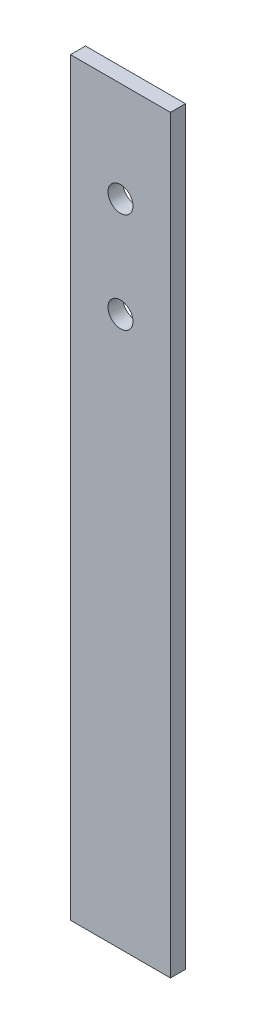
ISO-10303-21;
HEADER;
FILE_DESCRIPTION(('STEP AP214'),'2;1');
FILE_NAME('part.step','',(''),(''),'','','');
FILE_SCHEMA(('AUTOMOTIVE_DESIGN { 1 0 10303 214 1 1 1 1 }'));
ENDSEC;
DATA;
#1=APPLICATION_CONTEXT('core data for automotive mechanical design processes');
#2=APPLICATION_PROTOCOL_DEFINITION('international standard','automotive_design',2000,#1);
#3=PRODUCT_CONTEXT('',#1,'mechanical');
#4=PRODUCT('Part','Part','',(#3));
#5=PRODUCT_RELATED_PRODUCT_CATEGORY('part','',(#4));
#6=PRODUCT_DEFINITION_FORMATION('','',#4);
#7=PRODUCT_DEFINITION_CONTEXT('part definition',#1,'design');
#8=PRODUCT_DEFINITION('design','',#6,#7);
#9=PRODUCT_DEFINITION_SHAPE('','',#8);
#10=(LENGTH_UNIT() NAMED_UNIT(*) SI_UNIT(.MILLI.,.METRE.));
#11=(NAMED_UNIT(*) PLANE_ANGLE_UNIT() SI_UNIT($,.RADIAN.));
#12=(NAMED_UNIT(*) SI_UNIT($,.STERADIAN.) SOLID_ANGLE_UNIT());
#13=UNCERTAINTY_MEASURE_WITH_UNIT(LENGTH_MEASURE(1.E-05),#10,'distance_accuracy_value','');
#14=(GEOMETRIC_REPRESENTATION_CONTEXT(3) GLOBAL_UNCERTAINTY_ASSIGNED_CONTEXT((#13)) GLOBAL_UNIT_ASSIGNED_CONTEXT((#10,
#11,#12)) REPRESENTATION_CONTEXT('',''));
#15=CARTESIAN_POINT('',(0.,0.,0.));
#16=DIRECTION('',(0.,0.,1.));
#17=DIRECTION('',(1.,0.,0.));
#18=AXIS2_PLACEMENT_3D('',#15,#16,#17);
#19=CARTESIAN_POINT('',(92.469314483972,0.,3.));
#20=DIRECTION('',(1.,0.,0.));
#21=DIRECTION('',(0.,0.,-1.));
#22=AXIS2_PLACEMENT_3D('',#19,#20,#21);
#23=PLANE('',#22);
#24=DIRECTION('',(0.,-1.,0.));
#25=VECTOR('',#24,1.);
#26=CARTESIAN_POINT('',(92.469314483972,0.,0.));
#27=LINE('',#26,#25);
#28=CARTESIAN_POINT('',(92.469314483972,114.011656261006,0.));
#29=VERTEX_POINT('',#28);
#30=CARTESIAN_POINT('',(92.469314483972,-35.9883437389938,0.));
#31=VERTEX_POINT('',#30);
#32=EDGE_CURVE('E111',#29,#31,#27,.T.);
#33=ORIENTED_EDGE('',*,*,#32,.F.);
#34=DIRECTION('',(0.,0.,-1.));
#35=VECTOR('',#34,1.);
#36=CARTESIAN_POINT('',(92.469314483972,114.011656261006,3.));
#37=LINE('',#36,#35);
#38=CARTESIAN_POINT('',(92.469314483972,114.011656261006,3.));
#39=VERTEX_POINT('',#38);
#40=EDGE_CURVE('E11',#39,#29,#37,.T.);
#41=ORIENTED_EDGE('',*,*,#40,.F.);
#42=DIRECTION('',(0.,-1.,0.));
#43=VECTOR('',#42,1.);
#44=CARTESIAN_POINT('',(92.469314483972,0.,3.));
#45=LINE('',#44,#43);
#46=CARTESIAN_POINT('',(92.469314483972,-35.9883437389938,3.));
#47=VERTEX_POINT('',#46);
#48=EDGE_CURVE('E98',#39,#47,#45,.T.);
#49=ORIENTED_EDGE('',*,*,#48,.T.);
#50=DIRECTION('',(0.,0.,-1.));
#51=VECTOR('',#50,1.);
#52=CARTESIAN_POINT('',(92.469314483972,-35.9883437389938,3.));
#53=LINE('',#52,#51);
#54=EDGE_CURVE('E77',#47,#31,#53,.T.);
#55=ORIENTED_EDGE('',*,*,#54,.T.);
#56=EDGE_LOOP('',(#33,#41,#49,#55));
#57=FACE_BOUND('',#56,.T.);
#58=ADVANCED_FACE('F37',(#57),#23,.T.);
#59=CARTESIAN_POINT('',(0.,114.011656261006,3.));
#60=DIRECTION('',(0.,1.,0.));
#61=DIRECTION('',(0.,0.,1.));
#62=AXIS2_PLACEMENT_3D('',#59,#60,#61);
#63=PLANE('',#62);
#64=DIRECTION('',(1.,0.,0.));
#65=VECTOR('',#64,1.);
#66=CARTESIAN_POINT('',(0.,114.011656261006,0.));
#67=LINE('',#66,#65);
#68=CARTESIAN_POINT('',(72.4693144839719,114.011656261006,0.));
#69=VERTEX_POINT('',#68);
#70=EDGE_CURVE('E89',#69,#29,#67,.T.);
#71=ORIENTED_EDGE('',*,*,#70,.F.);
#72=DIRECTION('',(0.,0.,-1.));
#73=VECTOR('',#72,1.);
#74=CARTESIAN_POINT('',(72.4693144839719,114.011656261006,3.));
#75=LINE('',#74,#73);
#76=CARTESIAN_POINT('',(72.4693144839719,114.011656261006,3.));
#77=VERTEX_POINT('',#76);
#78=EDGE_CURVE('E46',#77,#69,#75,.T.);
#79=ORIENTED_EDGE('',*,*,#78,.F.);
#80=DIRECTION('',(1.,0.,0.));
#81=VECTOR('',#80,1.);
#82=CARTESIAN_POINT('',(0.,114.011656261006,3.));
#83=LINE('',#82,#81);
#84=EDGE_CURVE('E87',#77,#39,#83,.T.);
#85=ORIENTED_EDGE('',*,*,#84,.T.);
#86=ORIENTED_EDGE('',*,*,#40,.T.);
#87=EDGE_LOOP('',(#71,#79,#85,#86));
#88=FACE_BOUND('',#87,.T.);
#89=ADVANCED_FACE('F85',(#88),#63,.T.);
#90=CARTESIAN_POINT('',(72.469314483972,0.,3.));
#91=DIRECTION('',(1.,0.,0.));
#92=DIRECTION('',(0.,1.,0.));
#93=AXIS2_PLACEMENT_3D('',#90,#91,#92);
#94=PLANE('',#93);
#95=DIRECTION('',(0.,-1.,0.));
#96=VECTOR('',#95,1.);
#97=CARTESIAN_POINT('',(72.469314483972,0.,0.));
#98=LINE('',#97,#96);
#99=CARTESIAN_POINT('',(72.469314483972,-35.9883437389938,0.));
#100=VERTEX_POINT('',#99);
#101=EDGE_CURVE('E114',#69,#100,#98,.T.);
#102=ORIENTED_EDGE('',*,*,#101,.T.);
#103=DIRECTION('',(0.,0.,-1.));
#104=VECTOR('',#103,1.);
#105=CARTESIAN_POINT('',(72.469314483972,-35.9883437389938,3.));
#106=LINE('',#105,#104);
#107=CARTESIAN_POINT('',(72.469314483972,-35.9883437389938,3.));
#108=VERTEX_POINT('',#107);
#109=EDGE_CURVE('E92',#108,#100,#106,.T.);
#110=ORIENTED_EDGE('',*,*,#109,.F.);
#111=DIRECTION('',(0.,-1.,0.));
#112=VECTOR('',#111,1.);
#113=CARTESIAN_POINT('',(72.469314483972,0.,3.));
#114=LINE('',#113,#112);
#115=EDGE_CURVE('E94',#77,#108,#114,.T.);
#116=ORIENTED_EDGE('',*,*,#115,.F.);
#117=ORIENTED_EDGE('',*,*,#78,.T.);
#118=EDGE_LOOP('',(#102,#110,#116,#117));
#119=FACE_BOUND('',#118,.T.);
#120=ADVANCED_FACE('F95',(#119),#94,.F.);
#121=CARTESIAN_POINT('',(82.4693144839719,94.0116562610062,3.));
#122=DIRECTION('',(0.,0.,-1.));
#123=DIRECTION('',(-1.,0.,0.));
#124=AXIS2_PLACEMENT_3D('',#121,#122,#123);
#125=CYLINDRICAL_SURFACE('',#124,2.50000000000001);
#126=CARTESIAN_POINT('',(82.4693144839719,94.0116562610062,3.));
#127=DIRECTION('',(0.,0.,1.));
#128=DIRECTION('',(1.,0.,0.));
#129=AXIS2_PLACEMENT_3D('',#126,#127,#128);
#130=CIRCLE('',#129,2.50000000000001);
#131=CARTESIAN_POINT('',(84.969314483972,94.0116562610062,3.));
#132=VERTEX_POINT('',#131);
#133=EDGE_CURVE('E100',#132,#132,#130,.T.);
#134=ORIENTED_EDGE('',*,*,#133,.T.);
#135=EDGE_LOOP('',(#134));
#136=FACE_BOUND('',#135,.T.);
#137=CARTESIAN_POINT('',(82.4693144839719,94.0116562610062,0.));
#138=DIRECTION('',(0.,0.,1.));
#139=DIRECTION('',(1.,0.,0.));
#140=AXIS2_PLACEMENT_3D('',#137,#138,#139);
#141=CIRCLE('',#140,2.50000000000001);
#142=CARTESIAN_POINT('',(84.969314483972,94.0116562610062,0.));
#143=VERTEX_POINT('',#142);
#144=EDGE_CURVE('E108',#143,#143,#141,.T.);
#145=ORIENTED_EDGE('',*,*,#144,.F.);
#146=EDGE_LOOP('',(#145));
#147=FACE_BOUND('',#146,.T.);
#148=ADVANCED_FACE('F129',(#136,#147),#125,.F.);
#149=CARTESIAN_POINT('',(82.4693144839719,74.0116562610062,3.));
#150=DIRECTION('',(0.,0.,-1.));
#151=DIRECTION('',(-1.,0.,0.));
#152=AXIS2_PLACEMENT_3D('',#149,#150,#151);
#153=CYLINDRICAL_SURFACE('',#152,2.50000000000001);
#154=CARTESIAN_POINT('',(82.4693144839719,74.0116562610062,3.));
#155=DIRECTION('',(0.,0.,1.));
#156=DIRECTION('',(1.,0.,0.));
#157=AXIS2_PLACEMENT_3D('',#154,#155,#156);
#158=CIRCLE('',#157,2.50000000000001);
#159=CARTESIAN_POINT('',(84.969314483972,74.0116562610062,3.));
#160=VERTEX_POINT('',#159);
#161=EDGE_CURVE('E117',#160,#160,#158,.T.);
#162=ORIENTED_EDGE('',*,*,#161,.T.);
#163=EDGE_LOOP('',(#162));
#164=FACE_BOUND('',#163,.T.);
#165=CARTESIAN_POINT('',(82.4693144839719,74.0116562610062,0.));
#166=DIRECTION('',(0.,0.,1.));
#167=DIRECTION('',(1.,0.,0.));
#168=AXIS2_PLACEMENT_3D('',#165,#166,#167);
#169=CIRCLE('',#168,2.50000000000001);
#170=CARTESIAN_POINT('',(84.969314483972,74.0116562610062,0.));
#171=VERTEX_POINT('',#170);
#172=EDGE_CURVE('E105',#171,#171,#169,.T.);
#173=ORIENTED_EDGE('',*,*,#172,.F.);
#174=EDGE_LOOP('',(#173));
#175=FACE_BOUND('',#174,.T.);
#176=ADVANCED_FACE('F39',(#164,#175),#153,.F.);
#177=CARTESIAN_POINT('',(0.,-35.9883437389938,3.));
#178=DIRECTION('',(0.,1.,0.));
#179=DIRECTION('',(0.,0.,1.));
#180=AXIS2_PLACEMENT_3D('',#177,#178,#179);
#181=PLANE('',#180);
#182=DIRECTION('',(1.,0.,0.));
#183=VECTOR('',#182,1.);
#184=CARTESIAN_POINT('',(0.,-35.9883437389938,0.));
#185=LINE('',#184,#183);
#186=EDGE_CURVE('E70',#100,#31,#185,.T.);
#187=ORIENTED_EDGE('',*,*,#186,.T.);
#188=ORIENTED_EDGE('',*,*,#54,.F.);
#189=DIRECTION('',(1.,0.,0.));
#190=VECTOR('',#189,1.);
#191=CARTESIAN_POINT('',(0.,-35.9883437389938,3.));
#192=LINE('',#191,#190);
#193=EDGE_CURVE('E54',#108,#47,#192,.T.);
#194=ORIENTED_EDGE('',*,*,#193,.F.);
#195=ORIENTED_EDGE('',*,*,#109,.T.);
#196=EDGE_LOOP('',(#187,#188,#194,#195));
#197=FACE_BOUND('',#196,.T.);
#198=ADVANCED_FACE('F120',(#197),#181,.F.);
#199=CARTESIAN_POINT('',(0.,0.,3.));
#200=DIRECTION('',(0.,0.,1.));
#201=DIRECTION('',(1.,0.,0.));
#202=AXIS2_PLACEMENT_3D('',#199,#200,#201);
#203=PLANE('',#202);
#204=ORIENTED_EDGE('',*,*,#161,.F.);
#205=EDGE_LOOP('',(#204));
#206=FACE_BOUND('',#205,.T.);
#207=ORIENTED_EDGE('',*,*,#133,.F.);
#208=EDGE_LOOP('',(#207));
#209=FACE_BOUND('',#208,.T.);
#210=ORIENTED_EDGE('',*,*,#48,.F.);
#211=ORIENTED_EDGE('',*,*,#84,.F.);
#212=ORIENTED_EDGE('',*,*,#115,.T.);
#213=ORIENTED_EDGE('',*,*,#193,.T.);
#214=EDGE_LOOP('',(#210,#211,#212,#213));
#215=FACE_BOUND('',#214,.T.);
#216=ADVANCED_FACE('F97',(#206,#209,#215),#203,.T.);
#217=CARTESIAN_POINT('',(0.,0.,0.));
#218=DIRECTION('',(0.,0.,1.));
#219=DIRECTION('',(1.,0.,0.));
#220=AXIS2_PLACEMENT_3D('',#217,#218,#219);
#221=PLANE('',#220);
#222=ORIENTED_EDGE('',*,*,#172,.T.);
#223=EDGE_LOOP('',(#222));
#224=FACE_BOUND('',#223,.T.);
#225=ORIENTED_EDGE('',*,*,#144,.T.);
#226=EDGE_LOOP('',(#225));
#227=FACE_BOUND('',#226,.T.);
#228=ORIENTED_EDGE('',*,*,#32,.T.);
#229=ORIENTED_EDGE('',*,*,#186,.F.);
#230=ORIENTED_EDGE('',*,*,#101,.F.);
#231=ORIENTED_EDGE('',*,*,#70,.T.);
#232=EDGE_LOOP('',(#228,#229,#230,#231));
#233=FACE_BOUND('',#232,.T.);
#234=ADVANCED_FACE('F121',(#224,#227,#233),#221,.F.);
#235=CLOSED_SHELL('',(#58,#89,#120,#148,#176,#198,#216,#234));
#236=MANIFOLD_SOLID_BREP('B2',#235);
#237=ADVANCED_BREP_SHAPE_REPRESENTATION('',(#18,#236),#14);
#238=SHAPE_DEFINITION_REPRESENTATION(#9,#237);
ENDSEC;
END-ISO-10303-21;
